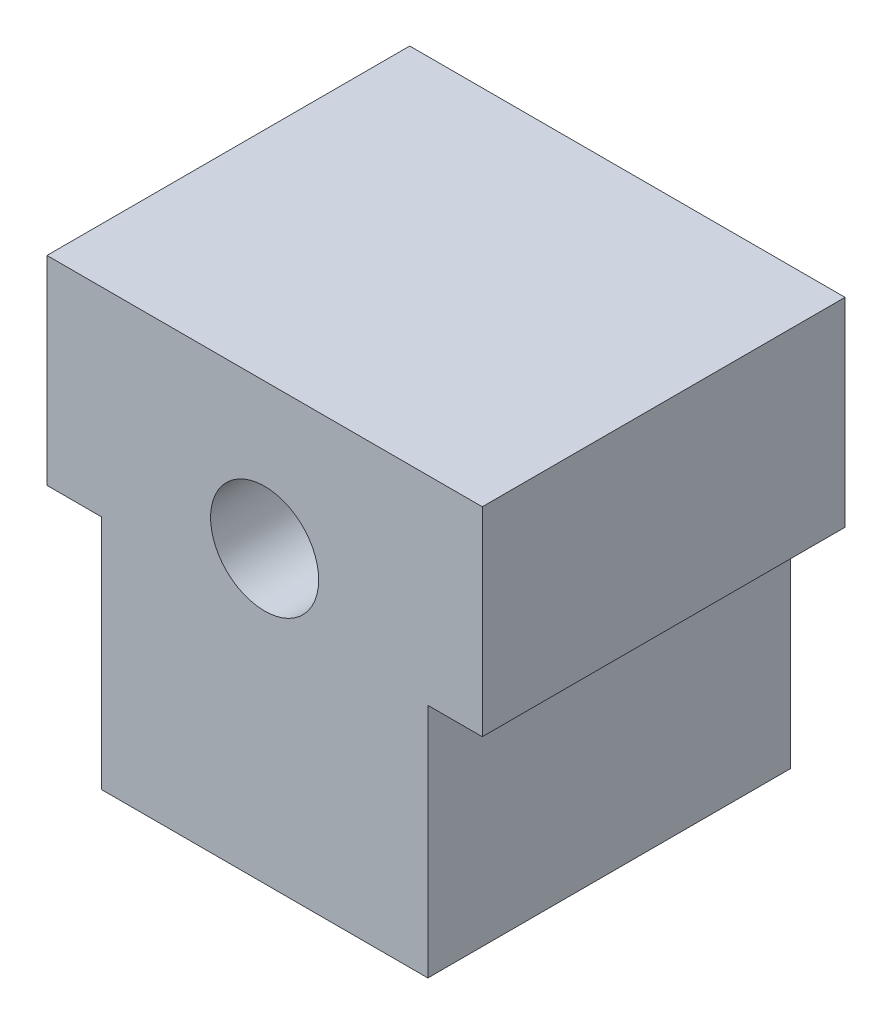
ISO-10303-21;
HEADER;
FILE_DESCRIPTION(('STEP AP214'),'2;1');
FILE_NAME('part.step','',(''),(''),'','','');
FILE_SCHEMA(('AUTOMOTIVE_DESIGN { 1 0 10303 214 1 1 1 1 }'));
ENDSEC;
DATA;
#1=APPLICATION_CONTEXT('core data for automotive mechanical design processes');
#2=APPLICATION_PROTOCOL_DEFINITION('international standard','automotive_design',2000,#1);
#3=PRODUCT_CONTEXT('',#1,'mechanical');
#4=PRODUCT('Part','Part','',(#3));
#5=PRODUCT_RELATED_PRODUCT_CATEGORY('part','',(#4));
#6=PRODUCT_DEFINITION_FORMATION('','',#4);
#7=PRODUCT_DEFINITION_CONTEXT('part definition',#1,'design');
#8=PRODUCT_DEFINITION('design','',#6,#7);
#9=PRODUCT_DEFINITION_SHAPE('','',#8);
#10=(LENGTH_UNIT() NAMED_UNIT(*) SI_UNIT(.MILLI.,.METRE.));
#11=(NAMED_UNIT(*) PLANE_ANGLE_UNIT() SI_UNIT($,.RADIAN.));
#12=(NAMED_UNIT(*) SI_UNIT($,.STERADIAN.) SOLID_ANGLE_UNIT());
#13=UNCERTAINTY_MEASURE_WITH_UNIT(LENGTH_MEASURE(1.E-05),#10,'distance_accuracy_value','');
#14=(GEOMETRIC_REPRESENTATION_CONTEXT(3) GLOBAL_UNCERTAINTY_ASSIGNED_CONTEXT((#13)) GLOBAL_UNIT_ASSIGNED_CONTEXT((#10,
#11,#12)) REPRESENTATION_CONTEXT('',''));
#15=CARTESIAN_POINT('',(0.,0.,0.));
#16=DIRECTION('',(0.,0.,1.));
#17=DIRECTION('',(1.,0.,0.));
#18=AXIS2_PLACEMENT_3D('',#15,#16,#17);
#19=CARTESIAN_POINT('',(0.,0.,10.));
#20=DIRECTION('',(0.,0.,-1.));
#21=DIRECTION('',(-1.,0.,0.));
#22=AXIS2_PLACEMENT_3D('',#19,#20,#21);
#23=PLANE('',#22);
#24=DIRECTION('',(0.,-1.,0.));
#25=VECTOR('',#24,1.);
#26=CARTESIAN_POINT('',(-8.79013449356208,4.826259827488,10.));
#27=LINE('',#26,#25);
#28=CARTESIAN_POINT('',(-8.79013449356208,4.826259827488,10.));
#29=VERTEX_POINT('',#28);
#30=CARTESIAN_POINT('',(-8.79013449356208,-0.663740172512,10.));
#31=VERTEX_POINT('',#30);
#32=EDGE_CURVE('E145',#29,#31,#27,.T.);
#33=ORIENTED_EDGE('',*,*,#32,.T.);
#34=DIRECTION('',(1.,0.,0.));
#35=VECTOR('',#34,1.);
#36=CARTESIAN_POINT('',(-7.29013449356208,-0.663740172511999,10.));
#37=LINE('',#36,#35);
#38=CARTESIAN_POINT('',(-7.29013449356208,-0.663740172511999,10.));
#39=VERTEX_POINT('',#38);
#40=EDGE_CURVE('E93',#31,#39,#37,.T.);
#41=ORIENTED_EDGE('',*,*,#40,.T.);
#42=DIRECTION('',(0.,-1.,0.));
#43=VECTOR('',#42,1.);
#44=CARTESIAN_POINT('',(-7.29013449356208,-0.663740172511999,10.));
#45=LINE('',#44,#43);
#46=CARTESIAN_POINT('',(-7.29013449356208,-7.173740172512,10.));
#47=VERTEX_POINT('',#46);
#48=EDGE_CURVE('E160',#39,#47,#45,.T.);
#49=ORIENTED_EDGE('',*,*,#48,.T.);
#50=DIRECTION('',(1.,0.,0.));
#51=VECTOR('',#50,1.);
#52=CARTESIAN_POINT('',(-7.29013449356208,-7.173740172512,10.));
#53=LINE('',#52,#51);
#54=CARTESIAN_POINT('',(1.70986550643792,-7.173740172512,10.));
#55=VERTEX_POINT('',#54);
#56=EDGE_CURVE('E173',#47,#55,#53,.T.);
#57=ORIENTED_EDGE('',*,*,#56,.T.);
#58=DIRECTION('',(0.,1.,0.));
#59=VECTOR('',#58,1.);
#60=CARTESIAN_POINT('',(1.70986550643792,-0.663740172511999,10.));
#61=LINE('',#60,#59);
#62=CARTESIAN_POINT('',(1.70986550643792,-0.663740172511999,10.));
#63=VERTEX_POINT('',#62);
#64=EDGE_CURVE('E112',#55,#63,#61,.T.);
#65=ORIENTED_EDGE('',*,*,#64,.T.);
#66=DIRECTION('',(1.,0.,0.));
#67=VECTOR('',#66,1.);
#68=CARTESIAN_POINT('',(1.70986550643792,-0.663740172511999,10.));
#69=LINE('',#68,#67);
#70=CARTESIAN_POINT('',(3.20986550643792,-0.663740172511999,10.));
#71=VERTEX_POINT('',#70);
#72=EDGE_CURVE('E106',#63,#71,#69,.T.);
#73=ORIENTED_EDGE('',*,*,#72,.T.);
#74=DIRECTION('',(0.,1.,0.));
#75=VECTOR('',#74,1.);
#76=CARTESIAN_POINT('',(3.20986550643792,4.826259827488,10.));
#77=LINE('',#76,#75);
#78=CARTESIAN_POINT('',(3.20986550643792,4.826259827488,10.));
#79=VERTEX_POINT('',#78);
#80=EDGE_CURVE('E110',#71,#79,#77,.T.);
#81=ORIENTED_EDGE('',*,*,#80,.T.);
#82=DIRECTION('',(-1.,0.,0.));
#83=VECTOR('',#82,1.);
#84=CARTESIAN_POINT('',(-8.79013449356208,4.826259827488,10.));
#85=LINE('',#84,#83);
#86=EDGE_CURVE('E50',#79,#29,#85,.T.);
#87=ORIENTED_EDGE('',*,*,#86,.T.);
#88=EDGE_LOOP('',(#33,#41,#49,#57,#65,#73,#81,#87));
#89=FACE_BOUND('',#88,.T.);
#90=CARTESIAN_POINT('',(-2.79013449356208,0.826259827488001,10.));
#91=DIRECTION('',(0.,0.,1.));
#92=DIRECTION('',(1.,0.,0.));
#93=AXIS2_PLACEMENT_3D('',#90,#91,#92);
#94=CIRCLE('',#93,1.49);
#95=CARTESIAN_POINT('',(-1.30013449356208,0.826259827488001,10.));
#96=VERTEX_POINT('',#95);
#97=EDGE_CURVE('E134',#96,#96,#94,.T.);
#98=ORIENTED_EDGE('',*,*,#97,.F.);
#99=EDGE_LOOP('',(#98));
#100=FACE_BOUND('',#99,.T.);
#101=ADVANCED_FACE('F33',(#89,#100),#23,.F.);
#102=CARTESIAN_POINT('',(0.,0.,0.));
#103=DIRECTION('',(0.,0.,-1.));
#104=DIRECTION('',(-1.,0.,0.));
#105=AXIS2_PLACEMENT_3D('',#102,#103,#104);
#106=PLANE('',#105);
#107=DIRECTION('',(0.,-1.,0.));
#108=VECTOR('',#107,1.);
#109=CARTESIAN_POINT('',(-8.79013449356208,4.826259827488,0.));
#110=LINE('',#109,#108);
#111=CARTESIAN_POINT('',(-8.79013449356208,4.826259827488,0.));
#112=VERTEX_POINT('',#111);
#113=CARTESIAN_POINT('',(-8.79013449356208,-0.663740172512,0.));
#114=VERTEX_POINT('',#113);
#115=EDGE_CURVE('E130',#112,#114,#110,.T.);
#116=ORIENTED_EDGE('',*,*,#115,.F.);
#117=DIRECTION('',(-1.,0.,0.));
#118=VECTOR('',#117,1.);
#119=CARTESIAN_POINT('',(-8.79013449356208,4.826259827488,0.));
#120=LINE('',#119,#118);
#121=CARTESIAN_POINT('',(3.20986550643792,4.826259827488,0.));
#122=VERTEX_POINT('',#121);
#123=EDGE_CURVE('E85',#122,#112,#120,.T.);
#124=ORIENTED_EDGE('',*,*,#123,.F.);
#125=DIRECTION('',(0.,1.,0.));
#126=VECTOR('',#125,1.);
#127=CARTESIAN_POINT('',(3.20986550643792,4.826259827488,0.));
#128=LINE('',#127,#126);
#129=CARTESIAN_POINT('',(3.20986550643792,-0.663740172511999,0.));
#130=VERTEX_POINT('',#129);
#131=EDGE_CURVE('E79',#130,#122,#128,.T.);
#132=ORIENTED_EDGE('',*,*,#131,.F.);
#133=DIRECTION('',(1.,0.,0.));
#134=VECTOR('',#133,1.);
#135=CARTESIAN_POINT('',(1.70986550643792,-0.663740172511999,0.));
#136=LINE('',#135,#134);
#137=CARTESIAN_POINT('',(1.70986550643792,-0.663740172511999,0.));
#138=VERTEX_POINT('',#137);
#139=EDGE_CURVE('E120',#138,#130,#136,.T.);
#140=ORIENTED_EDGE('',*,*,#139,.F.);
#141=DIRECTION('',(0.,1.,0.));
#142=VECTOR('',#141,1.);
#143=CARTESIAN_POINT('',(1.70986550643792,-0.663740172511999,0.));
#144=LINE('',#143,#142);
#145=CARTESIAN_POINT('',(1.70986550643792,-7.173740172512,0.));
#146=VERTEX_POINT('',#145);
#147=EDGE_CURVE('E140',#146,#138,#144,.T.);
#148=ORIENTED_EDGE('',*,*,#147,.F.);
#149=DIRECTION('',(1.,0.,0.));
#150=VECTOR('',#149,1.);
#151=CARTESIAN_POINT('',(-7.29013449356208,-7.173740172512,0.));
#152=LINE('',#151,#150);
#153=CARTESIAN_POINT('',(-7.29013449356208,-7.173740172512,0.));
#154=VERTEX_POINT('',#153);
#155=EDGE_CURVE('E138',#154,#146,#152,.T.);
#156=ORIENTED_EDGE('',*,*,#155,.F.);
#157=DIRECTION('',(0.,-1.,0.));
#158=VECTOR('',#157,1.);
#159=CARTESIAN_POINT('',(-7.29013449356208,-0.663740172511999,0.));
#160=LINE('',#159,#158);
#161=CARTESIAN_POINT('',(-7.29013449356208,-0.663740172511999,0.));
#162=VERTEX_POINT('',#161);
#163=EDGE_CURVE('E136',#162,#154,#160,.T.);
#164=ORIENTED_EDGE('',*,*,#163,.F.);
#165=DIRECTION('',(1.,0.,0.));
#166=VECTOR('',#165,1.);
#167=CARTESIAN_POINT('',(-7.29013449356208,-0.663740172511999,0.));
#168=LINE('',#167,#166);
#169=EDGE_CURVE('E133',#114,#162,#168,.T.);
#170=ORIENTED_EDGE('',*,*,#169,.F.);
#171=EDGE_LOOP('',(#116,#124,#132,#140,#148,#156,#164,#170));
#172=FACE_BOUND('',#171,.T.);
#173=CARTESIAN_POINT('',(-2.79013449356208,0.826259827488001,0.));
#174=DIRECTION('',(0.,0.,1.));
#175=DIRECTION('',(1.,0.,0.));
#176=AXIS2_PLACEMENT_3D('',#173,#174,#175);
#177=CIRCLE('',#176,1.49);
#178=CARTESIAN_POINT('',(-1.30013449356208,0.826259827488001,0.));
#179=VERTEX_POINT('',#178);
#180=EDGE_CURVE('E179',#179,#179,#177,.T.);
#181=ORIENTED_EDGE('',*,*,#180,.T.);
#182=EDGE_LOOP('',(#181));
#183=FACE_BOUND('',#182,.T.);
#184=ADVANCED_FACE('F164',(#172,#183),#106,.T.);
#185=CARTESIAN_POINT('',(-8.79013449356208,4.826259827488,10.));
#186=DIRECTION('',(1.,0.,0.));
#187=DIRECTION('',(0.,0.,-1.));
#188=AXIS2_PLACEMENT_3D('',#185,#186,#187);
#189=PLANE('',#188);
#190=ORIENTED_EDGE('',*,*,#115,.T.);
#191=DIRECTION('',(0.,0.,-1.));
#192=VECTOR('',#191,1.);
#193=CARTESIAN_POINT('',(-8.79013449356208,-0.663740172512,10.));
#194=LINE('',#193,#192);
#195=EDGE_CURVE('E11',#31,#114,#194,.T.);
#196=ORIENTED_EDGE('',*,*,#195,.F.);
#197=ORIENTED_EDGE('',*,*,#32,.F.);
#198=DIRECTION('',(0.,0.,-1.));
#199=VECTOR('',#198,1.);
#200=CARTESIAN_POINT('',(-8.79013449356208,4.826259827488,10.));
#201=LINE('',#200,#199);
#202=EDGE_CURVE('E126',#29,#112,#201,.T.);
#203=ORIENTED_EDGE('',*,*,#202,.T.);
#204=EDGE_LOOP('',(#190,#196,#197,#203));
#205=FACE_BOUND('',#204,.T.);
#206=ADVANCED_FACE('F35',(#205),#189,.F.);
#207=CARTESIAN_POINT('',(-7.29013449356208,-0.663740172511999,10.));
#208=DIRECTION('',(0.,1.,0.));
#209=DIRECTION('',(-1.,0.,0.));
#210=AXIS2_PLACEMENT_3D('',#207,#208,#209);
#211=PLANE('',#210);
#212=ORIENTED_EDGE('',*,*,#169,.T.);
#213=DIRECTION('',(0.,0.,-1.));
#214=VECTOR('',#213,1.);
#215=CARTESIAN_POINT('',(-7.29013449356208,-0.663740172511999,10.));
#216=LINE('',#215,#214);
#217=EDGE_CURVE('E42',#39,#162,#216,.T.);
#218=ORIENTED_EDGE('',*,*,#217,.F.);
#219=ORIENTED_EDGE('',*,*,#40,.F.);
#220=ORIENTED_EDGE('',*,*,#195,.T.);
#221=EDGE_LOOP('',(#212,#218,#219,#220));
#222=FACE_BOUND('',#221,.T.);
#223=ADVANCED_FACE('F207',(#222),#211,.F.);
#224=CARTESIAN_POINT('',(-7.29013449356208,-0.663740172511999,10.));
#225=DIRECTION('',(1.,0.,0.));
#226=DIRECTION('',(0.,1.,0.));
#227=AXIS2_PLACEMENT_3D('',#224,#225,#226);
#228=PLANE('',#227);
#229=ORIENTED_EDGE('',*,*,#163,.T.);
#230=DIRECTION('',(0.,0.,-1.));
#231=VECTOR('',#230,1.);
#232=CARTESIAN_POINT('',(-7.29013449356208,-7.173740172512,10.));
#233=LINE('',#232,#231);
#234=EDGE_CURVE('E152',#47,#154,#233,.T.);
#235=ORIENTED_EDGE('',*,*,#234,.F.);
#236=ORIENTED_EDGE('',*,*,#48,.F.);
#237=ORIENTED_EDGE('',*,*,#217,.T.);
#238=EDGE_LOOP('',(#229,#235,#236,#237));
#239=FACE_BOUND('',#238,.T.);
#240=ADVANCED_FACE('F158',(#239),#228,.F.);
#241=CARTESIAN_POINT('',(-7.29013449356208,-7.173740172512,10.));
#242=DIRECTION('',(0.,1.,0.));
#243=DIRECTION('',(0.,0.,1.));
#244=AXIS2_PLACEMENT_3D('',#241,#242,#243);
#245=PLANE('',#244);
#246=ORIENTED_EDGE('',*,*,#155,.T.);
#247=DIRECTION('',(0.,0.,-1.));
#248=VECTOR('',#247,1.);
#249=CARTESIAN_POINT('',(1.70986550643792,-7.173740172512,10.));
#250=LINE('',#249,#248);
#251=EDGE_CURVE('E149',#55,#146,#250,.T.);
#252=ORIENTED_EDGE('',*,*,#251,.F.);
#253=ORIENTED_EDGE('',*,*,#56,.F.);
#254=ORIENTED_EDGE('',*,*,#234,.T.);
#255=EDGE_LOOP('',(#246,#252,#253,#254));
#256=FACE_BOUND('',#255,.T.);
#257=ADVANCED_FACE('F169',(#256),#245,.F.);
#258=CARTESIAN_POINT('',(1.70986550643792,-0.663740172511999,10.));
#259=DIRECTION('',(-1.,0.,0.));
#260=DIRECTION('',(0.,-1.,0.));
#261=AXIS2_PLACEMENT_3D('',#258,#259,#260);
#262=PLANE('',#261);
#263=ORIENTED_EDGE('',*,*,#147,.T.);
#264=DIRECTION('',(0.,0.,-1.));
#265=VECTOR('',#264,1.);
#266=CARTESIAN_POINT('',(1.70986550643792,-0.663740172511999,10.));
#267=LINE('',#266,#265);
#268=EDGE_CURVE('E121',#63,#138,#267,.T.);
#269=ORIENTED_EDGE('',*,*,#268,.F.);
#270=ORIENTED_EDGE('',*,*,#64,.F.);
#271=ORIENTED_EDGE('',*,*,#251,.T.);
#272=EDGE_LOOP('',(#263,#269,#270,#271));
#273=FACE_BOUND('',#272,.T.);
#274=ADVANCED_FACE('F172',(#273),#262,.F.);
#275=CARTESIAN_POINT('',(1.70986550643792,-0.663740172511999,10.));
#276=DIRECTION('',(0.,1.,0.));
#277=DIRECTION('',(0.,0.,1.));
#278=AXIS2_PLACEMENT_3D('',#275,#276,#277);
#279=PLANE('',#278);
#280=ORIENTED_EDGE('',*,*,#139,.T.);
#281=DIRECTION('',(0.,0.,-1.));
#282=VECTOR('',#281,1.);
#283=CARTESIAN_POINT('',(3.20986550643792,-0.663740172511999,10.));
#284=LINE('',#283,#282);
#285=EDGE_CURVE('E117',#71,#130,#284,.T.);
#286=ORIENTED_EDGE('',*,*,#285,.F.);
#287=ORIENTED_EDGE('',*,*,#72,.F.);
#288=ORIENTED_EDGE('',*,*,#268,.T.);
#289=EDGE_LOOP('',(#280,#286,#287,#288));
#290=FACE_BOUND('',#289,.T.);
#291=ADVANCED_FACE('F118',(#290),#279,.F.);
#292=CARTESIAN_POINT('',(3.20986550643792,4.826259827488,10.));
#293=DIRECTION('',(-1.,0.,0.));
#294=DIRECTION('',(0.,-1.,0.));
#295=AXIS2_PLACEMENT_3D('',#292,#293,#294);
#296=PLANE('',#295);
#297=ORIENTED_EDGE('',*,*,#131,.T.);
#298=DIRECTION('',(0.,0.,-1.));
#299=VECTOR('',#298,1.);
#300=CARTESIAN_POINT('',(3.20986550643792,4.826259827488,10.));
#301=LINE('',#300,#299);
#302=EDGE_CURVE('E122',#79,#122,#301,.T.);
#303=ORIENTED_EDGE('',*,*,#302,.F.);
#304=ORIENTED_EDGE('',*,*,#80,.F.);
#305=ORIENTED_EDGE('',*,*,#285,.T.);
#306=EDGE_LOOP('',(#297,#303,#304,#305));
#307=FACE_BOUND('',#306,.T.);
#308=ADVANCED_FACE('F124',(#307),#296,.F.);
#309=CARTESIAN_POINT('',(-8.79013449356208,4.826259827488,10.));
#310=DIRECTION('',(0.,-1.,0.));
#311=DIRECTION('',(0.,0.,-1.));
#312=AXIS2_PLACEMENT_3D('',#309,#310,#311);
#313=PLANE('',#312);
#314=ORIENTED_EDGE('',*,*,#123,.T.);
#315=ORIENTED_EDGE('',*,*,#202,.F.);
#316=ORIENTED_EDGE('',*,*,#86,.F.);
#317=ORIENTED_EDGE('',*,*,#302,.T.);
#318=EDGE_LOOP('',(#314,#315,#316,#317));
#319=FACE_BOUND('',#318,.T.);
#320=ADVANCED_FACE('F195',(#319),#313,.F.);
#321=CARTESIAN_POINT('',(-2.79013449356208,0.826259827488001,10.));
#322=DIRECTION('',(0.,0.,-1.));
#323=DIRECTION('',(-1.,0.,0.));
#324=AXIS2_PLACEMENT_3D('',#321,#322,#323);
#325=CYLINDRICAL_SURFACE('',#324,1.49);
#326=ORIENTED_EDGE('',*,*,#97,.T.);
#327=EDGE_LOOP('',(#326));
#328=FACE_BOUND('',#327,.T.);
#329=ORIENTED_EDGE('',*,*,#180,.F.);
#330=EDGE_LOOP('',(#329));
#331=FACE_BOUND('',#330,.T.);
#332=ADVANCED_FACE('F185',(#328,#331),#325,.F.);
#333=CLOSED_SHELL('',(#101,#184,#206,#223,#240,#257,#274,#291,#308,#320,#332));
#334=MANIFOLD_SOLID_BREP('B2',#333);
#335=ADVANCED_BREP_SHAPE_REPRESENTATION('',(#18,#334),#14);
#336=SHAPE_DEFINITION_REPRESENTATION(#9,#335);
ENDSEC;
END-ISO-10303-21;
